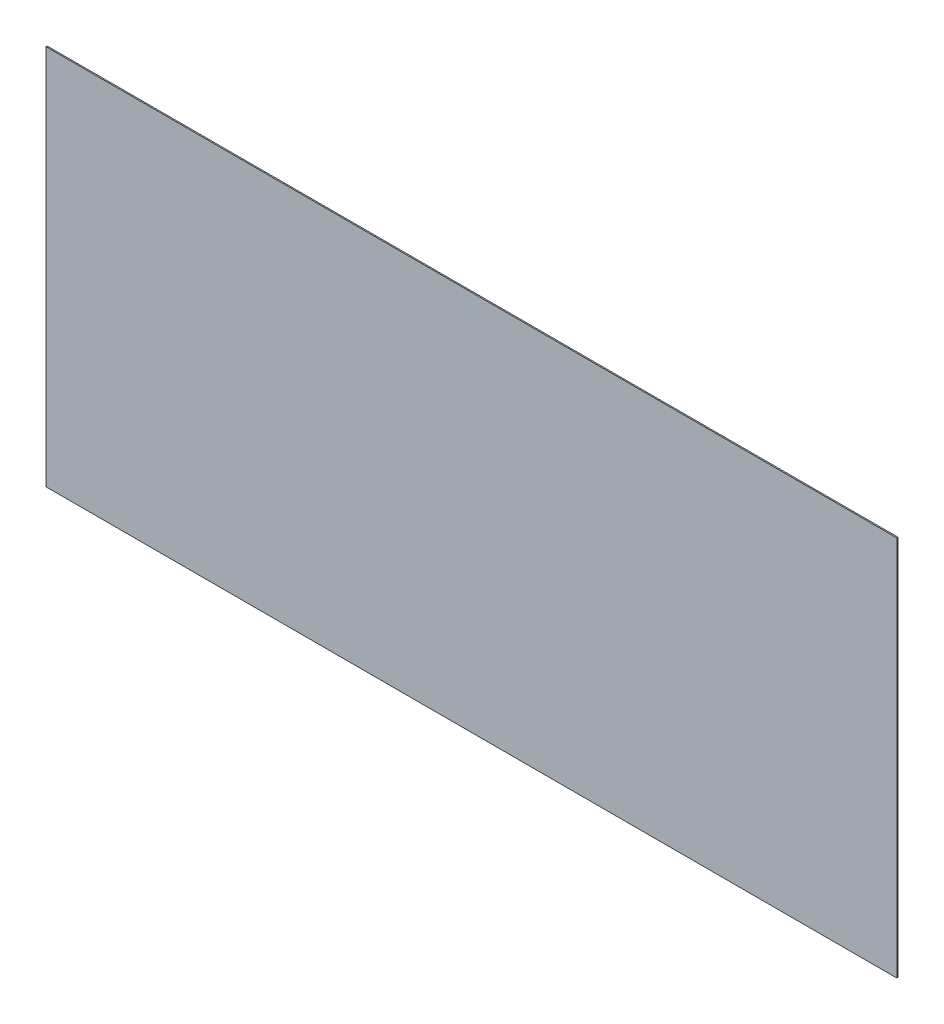
ISO-10303-21;
HEADER;
FILE_DESCRIPTION(('STEP AP214'),'2;1');
FILE_NAME('part.step','',(''),(''),'','','');
FILE_SCHEMA(('AUTOMOTIVE_DESIGN { 1 0 10303 214 1 1 1 1 }'));
ENDSEC;
DATA;
#1=APPLICATION_CONTEXT('core data for automotive mechanical design processes');
#2=APPLICATION_PROTOCOL_DEFINITION('international standard','automotive_design',2000,#1);
#3=PRODUCT_CONTEXT('',#1,'mechanical');
#4=PRODUCT('Part','Part','',(#3));
#5=PRODUCT_RELATED_PRODUCT_CATEGORY('part','',(#4));
#6=PRODUCT_DEFINITION_FORMATION('','',#4);
#7=PRODUCT_DEFINITION_CONTEXT('part definition',#1,'design');
#8=PRODUCT_DEFINITION('design','',#6,#7);
#9=PRODUCT_DEFINITION_SHAPE('','',#8);
#10=(LENGTH_UNIT() NAMED_UNIT(*) SI_UNIT(.MILLI.,.METRE.));
#11=(NAMED_UNIT(*) PLANE_ANGLE_UNIT() SI_UNIT($,.RADIAN.));
#12=(NAMED_UNIT(*) SI_UNIT($,.STERADIAN.) SOLID_ANGLE_UNIT());
#13=UNCERTAINTY_MEASURE_WITH_UNIT(LENGTH_MEASURE(1.E-05),#10,'distance_accuracy_value','');
#14=(GEOMETRIC_REPRESENTATION_CONTEXT(3) GLOBAL_UNCERTAINTY_ASSIGNED_CONTEXT((#13)) GLOBAL_UNIT_ASSIGNED_CONTEXT((#10,
#11,#12)) REPRESENTATION_CONTEXT('',''));
#15=CARTESIAN_POINT('',(0.,0.,0.));
#16=DIRECTION('',(0.,0.,1.));
#17=DIRECTION('',(1.,0.,0.));
#18=AXIS2_PLACEMENT_3D('',#15,#16,#17);
#19=CARTESIAN_POINT('',(125.000000000057,-291534.,150.327));
#20=DIRECTION('',(1.,0.,0.));
#21=DIRECTION('',(0.,1.,0.));
#22=AXIS2_PLACEMENT_3D('',#19,#20,#21);
#23=PLANE('',#22);
#24=DIRECTION('',(0.,0.,-1.));
#25=VECTOR('',#24,1.);
#26=CARTESIAN_POINT('',(125.000000000023,19.0000000000023,160.2));
#27=LINE('',#26,#25);
#28=CARTESIAN_POINT('',(125.000000000023,19.0000000000023,150.327));
#29=VERTEX_POINT('',#28);
#30=CARTESIAN_POINT('',(125.000000000023,19.0000000000023,150.2));
#31=VERTEX_POINT('',#30);
#32=EDGE_CURVE('E90',#29,#31,#27,.T.);
#33=ORIENTED_EDGE('',*,*,#32,.T.);
#34=DIRECTION('',(0.,-1.,0.));
#35=VECTOR('',#34,1.);
#36=CARTESIAN_POINT('',(125.000000000057,-291534.,150.2));
#37=LINE('',#36,#35);
#38=CARTESIAN_POINT('',(125.000000000023,60.0000000000023,150.2));
#39=VERTEX_POINT('',#38);
#40=EDGE_CURVE('E99',#39,#31,#37,.T.);
#41=ORIENTED_EDGE('',*,*,#40,.F.);
#42=DIRECTION('',(0.,0.,-1.));
#43=VECTOR('',#42,1.);
#44=CARTESIAN_POINT('',(125.000000000023,60.0000000000023,150.327));
#45=LINE('',#44,#43);
#46=CARTESIAN_POINT('',(125.000000000023,60.0000000000023,150.327));
#47=VERTEX_POINT('',#46);
#48=EDGE_CURVE('E11',#47,#39,#45,.T.);
#49=ORIENTED_EDGE('',*,*,#48,.F.);
#50=DIRECTION('',(0.,-1.,0.));
#51=VECTOR('',#50,1.);
#52=CARTESIAN_POINT('',(125.000000000057,-291534.,150.327));
#53=LINE('',#52,#51);
#54=EDGE_CURVE('E53',#47,#29,#53,.T.);
#55=ORIENTED_EDGE('',*,*,#54,.T.);
#56=EDGE_LOOP('',(#33,#41,#49,#55));
#57=FACE_BOUND('',#56,.T.);
#58=ADVANCED_FACE('F45',(#57),#23,.T.);
#59=CARTESIAN_POINT('',(-400000.,60.0000000000023,150.327));
#60=DIRECTION('',(0.,1.,0.));
#61=DIRECTION('',(0.,0.,1.));
#62=AXIS2_PLACEMENT_3D('',#59,#60,#61);
#63=PLANE('',#62);
#64=DIRECTION('',(0.,0.,-1.));
#65=VECTOR('',#64,1.);
#66=CARTESIAN_POINT('',(33.5,60.0000000000023,160.2));
#67=LINE('',#66,#65);
#68=CARTESIAN_POINT('',(33.5,60.0000000000023,150.327));
#69=VERTEX_POINT('',#68);
#70=CARTESIAN_POINT('',(33.5,60.0000000000023,150.2));
#71=VERTEX_POINT('',#70);
#72=EDGE_CURVE('E101',#69,#71,#67,.T.);
#73=ORIENTED_EDGE('',*,*,#72,.F.);
#74=DIRECTION('',(1.,0.,0.));
#75=VECTOR('',#74,1.);
#76=CARTESIAN_POINT('',(-400000.,60.0000000000023,150.327));
#77=LINE('',#76,#75);
#78=EDGE_CURVE('E68',#69,#47,#77,.T.);
#79=ORIENTED_EDGE('',*,*,#78,.T.);
#80=ORIENTED_EDGE('',*,*,#48,.T.);
#81=DIRECTION('',(1.,0.,0.));
#82=VECTOR('',#81,1.);
#83=CARTESIAN_POINT('',(-400000.,60.0000000000023,150.2));
#84=LINE('',#83,#82);
#85=EDGE_CURVE('E105',#71,#39,#84,.T.);
#86=ORIENTED_EDGE('',*,*,#85,.F.);
#87=EDGE_LOOP('',(#73,#79,#80,#86));
#88=FACE_BOUND('',#87,.T.);
#89=ADVANCED_FACE('F47',(#88),#63,.T.);
#90=CARTESIAN_POINT('',(0.,0.,150.327));
#91=DIRECTION('',(0.,0.,-1.));
#92=DIRECTION('',(-1.,0.,0.));
#93=AXIS2_PLACEMENT_3D('',#90,#91,#92);
#94=PLANE('',#93);
#95=ORIENTED_EDGE('',*,*,#78,.F.);
#96=DIRECTION('',(0.,-1.,0.));
#97=VECTOR('',#96,1.);
#98=CARTESIAN_POINT('',(33.5,0.,150.327));
#99=LINE('',#98,#97);
#100=CARTESIAN_POINT('',(33.5,19.0000000000023,150.327));
#101=VERTEX_POINT('',#100);
#102=EDGE_CURVE('E107',#69,#101,#99,.T.);
#103=ORIENTED_EDGE('',*,*,#102,.T.);
#104=DIRECTION('',(1.,0.,0.));
#105=VECTOR('',#104,1.);
#106=CARTESIAN_POINT('',(0.,19.0000000000023,150.327));
#107=LINE('',#106,#105);
#108=EDGE_CURVE('E113',#101,#29,#107,.T.);
#109=ORIENTED_EDGE('',*,*,#108,.T.);
#110=ORIENTED_EDGE('',*,*,#54,.F.);
#111=EDGE_LOOP('',(#95,#103,#109,#110));
#112=FACE_BOUND('',#111,.T.);
#113=ADVANCED_FACE('F119',(#112),#94,.F.);
#114=CARTESIAN_POINT('',(0.,0.,150.2));
#115=DIRECTION('',(0.,0.,-1.));
#116=DIRECTION('',(-1.,0.,0.));
#117=AXIS2_PLACEMENT_3D('',#114,#115,#116);
#118=PLANE('',#117);
#119=DIRECTION('',(0.,-1.,0.));
#120=VECTOR('',#119,1.);
#121=CARTESIAN_POINT('',(33.5,60.0000000000023,150.2));
#122=LINE('',#121,#120);
#123=CARTESIAN_POINT('',(33.5,19.0000000000023,150.2));
#124=VERTEX_POINT('',#123);
#125=EDGE_CURVE('E60',#71,#124,#122,.T.);
#126=ORIENTED_EDGE('',*,*,#125,.F.);
#127=ORIENTED_EDGE('',*,*,#85,.T.);
#128=ORIENTED_EDGE('',*,*,#40,.T.);
#129=DIRECTION('',(1.,0.,0.));
#130=VECTOR('',#129,1.);
#131=CARTESIAN_POINT('',(125.000000000023,19.0000000000023,150.2));
#132=LINE('',#131,#130);
#133=EDGE_CURVE('E87',#124,#31,#132,.T.);
#134=ORIENTED_EDGE('',*,*,#133,.F.);
#135=EDGE_LOOP('',(#126,#127,#128,#134));
#136=FACE_BOUND('',#135,.T.);
#137=ADVANCED_FACE('F103',(#136),#118,.T.);
#138=CARTESIAN_POINT('',(33.5,60.0000000000023,160.2));
#139=DIRECTION('',(1.,0.,0.));
#140=DIRECTION('',(0.,1.,0.));
#141=AXIS2_PLACEMENT_3D('',#138,#139,#140);
#142=PLANE('',#141);
#143=ORIENTED_EDGE('',*,*,#72,.T.);
#144=ORIENTED_EDGE('',*,*,#125,.T.);
#145=DIRECTION('',(0.,0.,-1.));
#146=VECTOR('',#145,1.);
#147=CARTESIAN_POINT('',(33.5,19.0000000000023,160.2));
#148=LINE('',#147,#146);
#149=EDGE_CURVE('E92',#101,#124,#148,.T.);
#150=ORIENTED_EDGE('',*,*,#149,.F.);
#151=ORIENTED_EDGE('',*,*,#102,.F.);
#152=EDGE_LOOP('',(#143,#144,#150,#151));
#153=FACE_BOUND('',#152,.T.);
#154=ADVANCED_FACE('F117',(#153),#142,.F.);
#155=CARTESIAN_POINT('',(125.000000000023,19.0000000000023,160.2));
#156=DIRECTION('',(0.,1.,0.));
#157=DIRECTION('',(0.,0.,1.));
#158=AXIS2_PLACEMENT_3D('',#155,#156,#157);
#159=PLANE('',#158);
#160=ORIENTED_EDGE('',*,*,#149,.T.);
#161=ORIENTED_EDGE('',*,*,#133,.T.);
#162=ORIENTED_EDGE('',*,*,#32,.F.);
#163=ORIENTED_EDGE('',*,*,#108,.F.);
#164=EDGE_LOOP('',(#160,#161,#162,#163));
#165=FACE_BOUND('',#164,.T.);
#166=ADVANCED_FACE('F89',(#165),#159,.F.);
#167=CLOSED_SHELL('',(#58,#89,#113,#137,#154,#166));
#168=MANIFOLD_SOLID_BREP('B2',#167);
#169=ADVANCED_BREP_SHAPE_REPRESENTATION('',(#18,#168),#14);
#170=SHAPE_DEFINITION_REPRESENTATION(#9,#169);
ENDSEC;
END-ISO-10303-21;
